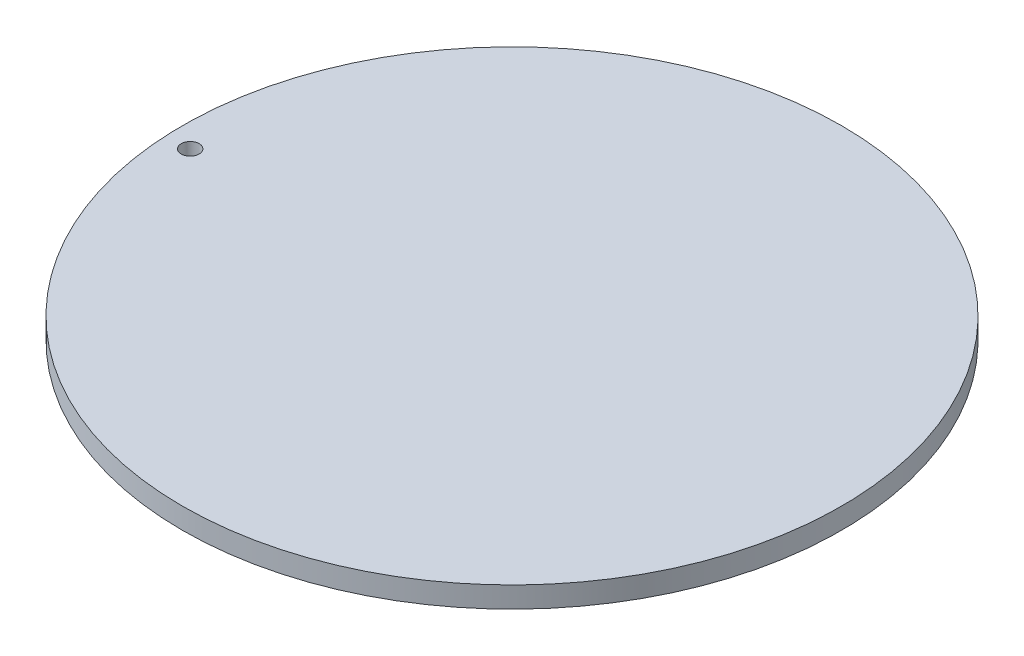
ISO-10303-21;
HEADER;
FILE_DESCRIPTION(('STEP AP214'),'2;1');
FILE_NAME('part.step','',(''),(''),'','','');
FILE_SCHEMA(('AUTOMOTIVE_DESIGN { 1 0 10303 214 1 1 1 1 }'));
ENDSEC;
DATA;
#1=APPLICATION_CONTEXT('core data for automotive mechanical design processes');
#2=APPLICATION_PROTOCOL_DEFINITION('international standard','automotive_design',2000,#1);
#3=PRODUCT_CONTEXT('',#1,'mechanical');
#4=PRODUCT('Part','Part','',(#3));
#5=PRODUCT_RELATED_PRODUCT_CATEGORY('part','',(#4));
#6=PRODUCT_DEFINITION_FORMATION('','',#4);
#7=PRODUCT_DEFINITION_CONTEXT('part definition',#1,'design');
#8=PRODUCT_DEFINITION('design','',#6,#7);
#9=PRODUCT_DEFINITION_SHAPE('','',#8);
#10=(LENGTH_UNIT() NAMED_UNIT(*) SI_UNIT(.MILLI.,.METRE.));
#11=(NAMED_UNIT(*) PLANE_ANGLE_UNIT() SI_UNIT($,.RADIAN.));
#12=(NAMED_UNIT(*) SI_UNIT($,.STERADIAN.) SOLID_ANGLE_UNIT());
#13=UNCERTAINTY_MEASURE_WITH_UNIT(LENGTH_MEASURE(1.E-05),#10,'distance_accuracy_value','');
#14=(GEOMETRIC_REPRESENTATION_CONTEXT(3) GLOBAL_UNCERTAINTY_ASSIGNED_CONTEXT((#13)) GLOBAL_UNIT_ASSIGNED_CONTEXT((#10,
#11,#12)) REPRESENTATION_CONTEXT('',''));
#15=CARTESIAN_POINT('',(0.,0.,0.));
#16=DIRECTION('',(0.,0.,1.));
#17=DIRECTION('',(1.,0.,0.));
#18=AXIS2_PLACEMENT_3D('',#15,#16,#17);
#19=CARTESIAN_POINT('',(0.,4.35178261993757,0.));
#20=DIRECTION('',(0.,-1.,0.));
#21=DIRECTION('',(0.,0.,-1.));
#22=AXIS2_PLACEMENT_3D('',#19,#20,#21);
#23=PLANE('',#22);
#24=CARTESIAN_POINT('',(-102.,4.35178261993757,5.41512315902537));
#25=DIRECTION('',(0.,1.,0.));
#26=DIRECTION('',(0.,0.,1.));
#27=AXIS2_PLACEMENT_3D('',#24,#25,#26);
#28=CIRCLE('',#27,2.99999999999999);
#29=CARTESIAN_POINT('',(-102.,4.35178261993757,8.41512315902536));
#30=VERTEX_POINT('',#29);
#31=EDGE_CURVE('E44',#30,#30,#28,.T.);
#32=ORIENTED_EDGE('',*,*,#31,.F.);
#33=EDGE_LOOP('',(#32));
#34=FACE_BOUND('',#33,.T.);
#35=CARTESIAN_POINT('',(0.,4.35178261993757,0.));
#36=DIRECTION('',(0.,1.,0.));
#37=DIRECTION('',(0.,0.,1.));
#38=AXIS2_PLACEMENT_3D('',#35,#36,#37);
#39=CIRCLE('',#38,110.);
#40=CARTESIAN_POINT('',(0.,4.35178261993757,110.));
#41=VERTEX_POINT('',#40);
#42=EDGE_CURVE('E10',#41,#41,#39,.T.);
#43=ORIENTED_EDGE('',*,*,#42,.T.);
#44=EDGE_LOOP('',(#43));
#45=FACE_BOUND('',#44,.T.);
#46=ADVANCED_FACE('F31',(#34,#45),#23,.F.);
#47=CARTESIAN_POINT('',(0.,25.1330326199376,0.));
#48=DIRECTION('',(0.,1.,0.));
#49=DIRECTION('',(0.,0.,1.));
#50=AXIS2_PLACEMENT_3D('',#47,#48,#49);
#51=CYLINDRICAL_SURFACE('',#50,110.);
#52=ORIENTED_EDGE('',*,*,#42,.F.);
#53=EDGE_LOOP('',(#52));
#54=FACE_BOUND('',#53,.T.);
#55=CARTESIAN_POINT('',(0.,-2.64821738006241,0.));
#56=DIRECTION('',(0.,1.,0.));
#57=DIRECTION('',(0.,0.,1.));
#58=AXIS2_PLACEMENT_3D('',#55,#56,#57);
#59=CIRCLE('',#58,110.);
#60=CARTESIAN_POINT('',(0.,-2.64821738006241,110.));
#61=VERTEX_POINT('',#60);
#62=EDGE_CURVE('E38',#61,#61,#59,.T.);
#63=ORIENTED_EDGE('',*,*,#62,.T.);
#64=EDGE_LOOP('',(#63));
#65=FACE_BOUND('',#64,.T.);
#66=ADVANCED_FACE('F60',(#54,#65),#51,.T.);
#67=CARTESIAN_POINT('',(110.,-2.64821738006242,0.));
#68=DIRECTION('',(0.,1.,0.));
#69=DIRECTION('',(0.,0.,1.));
#70=AXIS2_PLACEMENT_3D('',#67,#68,#69);
#71=PLANE('',#70);
#72=CARTESIAN_POINT('',(-102.,-2.64821738006242,5.41512315902537));
#73=DIRECTION('',(0.,1.,0.));
#74=DIRECTION('',(0.,0.,1.));
#75=AXIS2_PLACEMENT_3D('',#72,#73,#74);
#76=CIRCLE('',#75,2.99999999999999);
#77=CARTESIAN_POINT('',(-102.,-2.64821738006242,8.41512315902536));
#78=VERTEX_POINT('',#77);
#79=EDGE_CURVE('E34',#78,#78,#76,.T.);
#80=ORIENTED_EDGE('',*,*,#79,.T.);
#81=EDGE_LOOP('',(#80));
#82=FACE_BOUND('',#81,.T.);
#83=ORIENTED_EDGE('',*,*,#62,.F.);
#84=EDGE_LOOP('',(#83));
#85=FACE_BOUND('',#84,.T.);
#86=ADVANCED_FACE('F51',(#82,#85),#71,.F.);
#87=CARTESIAN_POINT('',(-102.,-5.64821738006243,5.41512315902537));
#88=DIRECTION('',(0.,1.,0.));
#89=DIRECTION('',(0.,0.,1.));
#90=AXIS2_PLACEMENT_3D('',#87,#88,#89);
#91=CYLINDRICAL_SURFACE('',#90,2.99999999999999);
#92=ORIENTED_EDGE('',*,*,#31,.T.);
#93=EDGE_LOOP('',(#92));
#94=FACE_BOUND('',#93,.T.);
#95=ORIENTED_EDGE('',*,*,#79,.F.);
#96=EDGE_LOOP('',(#95));
#97=FACE_BOUND('',#96,.T.);
#98=ADVANCED_FACE('F54',(#94,#97),#91,.F.);
#99=CLOSED_SHELL('',(#46,#66,#86,#98));
#100=MANIFOLD_SOLID_BREP('B2',#99);
#101=ADVANCED_BREP_SHAPE_REPRESENTATION('',(#18,#100),#14);
#102=SHAPE_DEFINITION_REPRESENTATION(#9,#101);
ENDSEC;
END-ISO-10303-21;
